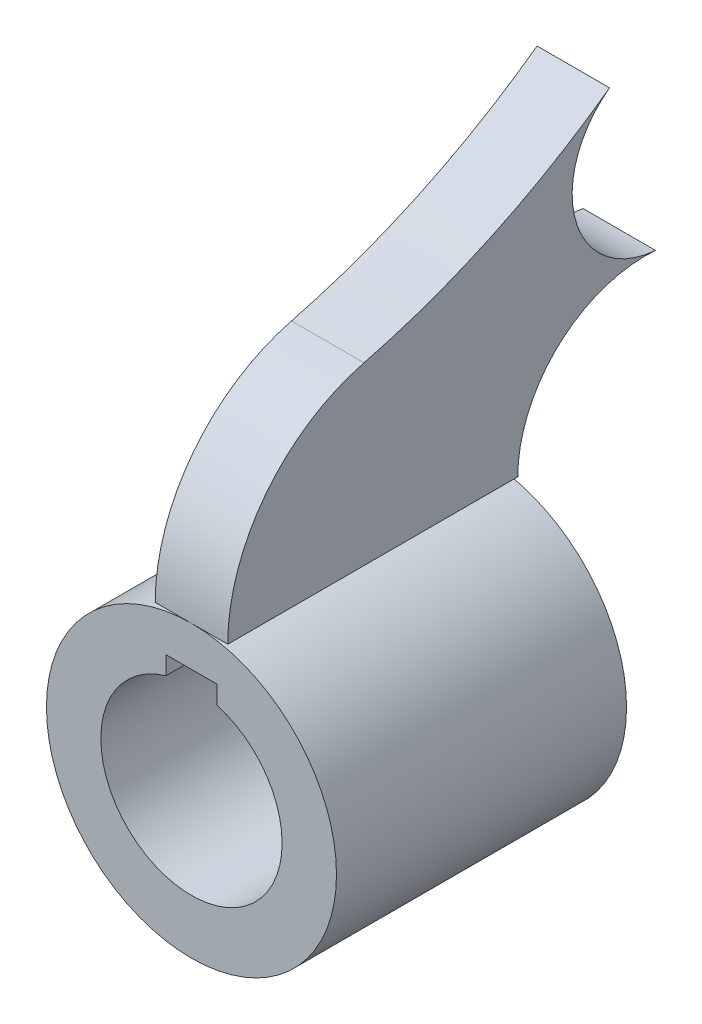
ISO-10303-21;
HEADER;
FILE_DESCRIPTION(('STEP AP214'),'2;1');
FILE_NAME('part.step','',(''),(''),'','','');
FILE_SCHEMA(('AUTOMOTIVE_DESIGN { 1 0 10303 214 1 1 1 1 }'));
ENDSEC;
DATA;
#1=APPLICATION_CONTEXT('core data for automotive mechanical design processes');
#2=APPLICATION_PROTOCOL_DEFINITION('international standard','automotive_design',2000,#1);
#3=PRODUCT_CONTEXT('',#1,'mechanical');
#4=PRODUCT('Part','Part','',(#3));
#5=PRODUCT_RELATED_PRODUCT_CATEGORY('part','',(#4));
#6=PRODUCT_DEFINITION_FORMATION('','',#4);
#7=PRODUCT_DEFINITION_CONTEXT('part definition',#1,'design');
#8=PRODUCT_DEFINITION('design','',#6,#7);
#9=PRODUCT_DEFINITION_SHAPE('','',#8);
#10=(LENGTH_UNIT() NAMED_UNIT(*) SI_UNIT(.MILLI.,.METRE.));
#11=(NAMED_UNIT(*) PLANE_ANGLE_UNIT() SI_UNIT($,.RADIAN.));
#12=(NAMED_UNIT(*) SI_UNIT($,.STERADIAN.) SOLID_ANGLE_UNIT());
#13=UNCERTAINTY_MEASURE_WITH_UNIT(LENGTH_MEASURE(1.E-05),#10,'distance_accuracy_value','');
#14=(GEOMETRIC_REPRESENTATION_CONTEXT(3) GLOBAL_UNCERTAINTY_ASSIGNED_CONTEXT((#13)) GLOBAL_UNIT_ASSIGNED_CONTEXT((#10,
#11,#12)) REPRESENTATION_CONTEXT('',''));
#15=CARTESIAN_POINT('',(0.,0.,0.));
#16=DIRECTION('',(0.,0.,1.));
#17=DIRECTION('',(1.,0.,0.));
#18=AXIS2_PLACEMENT_3D('',#15,#16,#17);
#19=CARTESIAN_POINT('',(10.,40.,0.));
#20=DIRECTION('',(0.,1.,0.));
#21=DIRECTION('',(0.,0.,1.));
#22=AXIS2_PLACEMENT_3D('',#19,#20,#21);
#23=PLANE('',#22);
#24=DIRECTION('',(0.,0.,-1.));
#25=VECTOR('',#24,1.);
#26=CARTESIAN_POINT('',(-10.,40.,0.));
#27=LINE('',#26,#25);
#28=CARTESIAN_POINT('',(-10.,40.,0.));
#29=VERTEX_POINT('',#28);
#30=CARTESIAN_POINT('',(-10.,40.,-80.));
#31=VERTEX_POINT('',#30);
#32=EDGE_CURVE('E131',#29,#31,#27,.T.);
#33=ORIENTED_EDGE('',*,*,#32,.T.);
#34=DIRECTION('',(-1.,0.,0.));
#35=VECTOR('',#34,1.);
#36=CARTESIAN_POINT('',(10.,40.,-80.));
#37=LINE('',#36,#35);
#38=CARTESIAN_POINT('',(10.,40.,-80.));
#39=VERTEX_POINT('',#38);
#40=EDGE_CURVE('E12',#39,#31,#37,.T.);
#41=ORIENTED_EDGE('',*,*,#40,.F.);
#42=DIRECTION('',(0.,0.,-1.));
#43=VECTOR('',#42,1.);
#44=CARTESIAN_POINT('',(10.,40.,0.));
#45=LINE('',#44,#43);
#46=CARTESIAN_POINT('',(10.,40.,0.));
#47=VERTEX_POINT('',#46);
#48=EDGE_CURVE('E145',#47,#39,#45,.T.);
#49=ORIENTED_EDGE('',*,*,#48,.F.);
#50=DIRECTION('',(-1.,0.,0.));
#51=VECTOR('',#50,1.);
#52=CARTESIAN_POINT('',(10.,40.,0.));
#53=LINE('',#52,#51);
#54=EDGE_CURVE('E71',#47,#29,#53,.T.);
#55=ORIENTED_EDGE('',*,*,#54,.T.);
#56=EDGE_LOOP('',(#33,#41,#49,#55));
#57=FACE_BOUND('',#56,.T.);
#58=ADVANCED_FACE('F60',(#57),#23,.F.);
#59=CARTESIAN_POINT('',(10.,40.,-115.192307692308));
#60=DIRECTION('',(-1.,0.,0.));
#61=DIRECTION('',(0.,0.,1.));
#62=AXIS2_PLACEMENT_3D('',#59,#60,#61);
#63=CYLINDRICAL_SURFACE('',#62,35.1923076923077);
#64=CARTESIAN_POINT('',(-10.,40.,-115.192307692308));
#65=DIRECTION('',(1.,0.,0.));
#66=DIRECTION('',(0.,0.,-1.));
#67=AXIS2_PLACEMENT_3D('',#64,#65,#66);
#68=CIRCLE('',#67,35.1923076923077);
#69=CARTESIAN_POINT('',(-10.,75.0798722044728,-118.003194888179));
#70=VERTEX_POINT('',#69);
#71=EDGE_CURVE('E133',#31,#70,#68,.F.);
#72=ORIENTED_EDGE('',*,*,#71,.T.);
#73=DIRECTION('',(-1.,0.,0.));
#74=VECTOR('',#73,1.);
#75=CARTESIAN_POINT('',(10.,75.0798722044728,-118.003194888179));
#76=LINE('',#75,#74);
#77=CARTESIAN_POINT('',(10.,75.0798722044728,-118.003194888179));
#78=VERTEX_POINT('',#77);
#79=EDGE_CURVE('E64',#78,#70,#76,.T.);
#80=ORIENTED_EDGE('',*,*,#79,.F.);
#81=CARTESIAN_POINT('',(10.,40.,-115.192307692308));
#82=DIRECTION('',(1.,0.,0.));
#83=DIRECTION('',(0.,0.,-1.));
#84=AXIS2_PLACEMENT_3D('',#81,#82,#83);
#85=CIRCLE('',#84,35.1923076923077);
#86=EDGE_CURVE('E105',#39,#78,#85,.F.);
#87=ORIENTED_EDGE('',*,*,#86,.F.);
#88=ORIENTED_EDGE('',*,*,#40,.T.);
#89=EDGE_LOOP('',(#72,#80,#87,#88));
#90=FACE_BOUND('',#89,.T.);
#91=ADVANCED_FACE('F143',(#90),#63,.F.);
#92=CARTESIAN_POINT('',(10.,100.,-120.));
#93=DIRECTION('',(-1.,0.,0.));
#94=DIRECTION('',(0.,0.,1.));
#95=AXIS2_PLACEMENT_3D('',#92,#93,#94);
#96=CYLINDRICAL_SURFACE('',#95,25.);
#97=CARTESIAN_POINT('',(-10.,100.,-120.));
#98=DIRECTION('',(1.,0.,0.));
#99=DIRECTION('',(0.,0.,-1.));
#100=AXIS2_PLACEMENT_3D('',#97,#98,#99);
#101=CIRCLE('',#100,25.);
#102=CARTESIAN_POINT('',(-10.,120.242034065651,-105.328256515157));
#103=VERTEX_POINT('',#102);
#104=EDGE_CURVE('E114',#103,#70,#101,.T.);
#105=ORIENTED_EDGE('',*,*,#104,.F.);
#106=DIRECTION('',(-1.,0.,0.));
#107=VECTOR('',#106,1.);
#108=CARTESIAN_POINT('',(10.,120.242034065651,-105.328256515157));
#109=LINE('',#108,#107);
#110=CARTESIAN_POINT('',(10.,120.242034065651,-105.328256515157));
#111=VERTEX_POINT('',#110);
#112=EDGE_CURVE('E107',#111,#103,#109,.T.);
#113=ORIENTED_EDGE('',*,*,#112,.F.);
#114=CARTESIAN_POINT('',(10.,100.,-120.));
#115=DIRECTION('',(1.,0.,0.));
#116=DIRECTION('',(0.,0.,-1.));
#117=AXIS2_PLACEMENT_3D('',#114,#115,#116);
#118=CIRCLE('',#117,25.);
#119=EDGE_CURVE('E115',#111,#78,#118,.T.);
#120=ORIENTED_EDGE('',*,*,#119,.T.);
#121=ORIENTED_EDGE('',*,*,#79,.T.);
#122=EDGE_LOOP('',(#105,#113,#120,#121));
#123=FACE_BOUND('',#122,.T.);
#124=ADVANCED_FACE('F112',(#123),#96,.F.);
#125=CARTESIAN_POINT('',(10.,282.178306590855,12.04569136359));
#126=DIRECTION('',(-1.,0.,0.));
#127=DIRECTION('',(0.,0.,1.));
#128=AXIS2_PLACEMENT_3D('',#125,#126,#127);
#129=CYLINDRICAL_SURFACE('',#128,200.);
#130=CARTESIAN_POINT('',(-10.,282.178306590855,12.04569136359));
#131=DIRECTION('',(1.,0.,0.));
#132=DIRECTION('',(0.,0.,-1.));
#133=AXIS2_PLACEMENT_3D('',#130,#131,#132);
#134=CIRCLE('',#133,200.);
#135=CARTESIAN_POINT('',(-10.,88.435661318171,-37.590861727282));
#136=VERTEX_POINT('',#135);
#137=EDGE_CURVE('E140',#136,#103,#134,.T.);
#138=ORIENTED_EDGE('',*,*,#137,.F.);
#139=DIRECTION('',(-1.,0.,0.));
#140=VECTOR('',#139,1.);
#141=CARTESIAN_POINT('',(10.,88.435661318171,-37.590861727282));
#142=LINE('',#141,#140);
#143=CARTESIAN_POINT('',(10.,88.435661318171,-37.590861727282));
#144=VERTEX_POINT('',#143);
#145=EDGE_CURVE('E89',#144,#136,#142,.T.);
#146=ORIENTED_EDGE('',*,*,#145,.F.);
#147=CARTESIAN_POINT('',(10.,282.178306590855,12.04569136359));
#148=DIRECTION('',(1.,0.,0.));
#149=DIRECTION('',(0.,0.,-1.));
#150=AXIS2_PLACEMENT_3D('',#147,#148,#149);
#151=CIRCLE('',#150,200.);
#152=EDGE_CURVE('E121',#144,#111,#151,.T.);
#153=ORIENTED_EDGE('',*,*,#152,.T.);
#154=ORIENTED_EDGE('',*,*,#112,.T.);
#155=EDGE_LOOP('',(#138,#146,#153,#154));
#156=FACE_BOUND('',#155,.T.);
#157=ADVANCED_FACE('F124',(#156),#129,.F.);
#158=CARTESIAN_POINT('',(10.,40.,-50.));
#159=DIRECTION('',(-1.,0.,0.));
#160=DIRECTION('',(0.,0.,1.));
#161=AXIS2_PLACEMENT_3D('',#158,#159,#160);
#162=CYLINDRICAL_SURFACE('',#161,50.);
#163=CARTESIAN_POINT('',(-10.,40.,-50.));
#164=DIRECTION('',(1.,0.,0.));
#165=DIRECTION('',(0.,0.,-1.));
#166=AXIS2_PLACEMENT_3D('',#163,#164,#165);
#167=CIRCLE('',#166,50.);
#168=EDGE_CURVE('E137',#29,#136,#167,.F.);
#169=ORIENTED_EDGE('',*,*,#168,.F.);
#170=ORIENTED_EDGE('',*,*,#54,.F.);
#171=CARTESIAN_POINT('',(10.,40.,-50.));
#172=DIRECTION('',(1.,0.,0.));
#173=DIRECTION('',(0.,0.,-1.));
#174=AXIS2_PLACEMENT_3D('',#171,#172,#173);
#175=CIRCLE('',#174,50.);
#176=EDGE_CURVE('E128',#47,#144,#175,.F.);
#177=ORIENTED_EDGE('',*,*,#176,.T.);
#178=ORIENTED_EDGE('',*,*,#145,.T.);
#179=EDGE_LOOP('',(#169,#170,#177,#178));
#180=FACE_BOUND('',#179,.T.);
#181=ADVANCED_FACE('F149',(#180),#162,.T.);
#182=CARTESIAN_POINT('',(10.,0.,0.));
#183=DIRECTION('',(1.,0.,0.));
#184=DIRECTION('',(0.,0.,-1.));
#185=AXIS2_PLACEMENT_3D('',#182,#183,#184);
#186=PLANE('',#185);
#187=ORIENTED_EDGE('',*,*,#48,.T.);
#188=ORIENTED_EDGE('',*,*,#86,.T.);
#189=ORIENTED_EDGE('',*,*,#119,.F.);
#190=ORIENTED_EDGE('',*,*,#152,.F.);
#191=ORIENTED_EDGE('',*,*,#176,.F.);
#192=EDGE_LOOP('',(#187,#188,#189,#190,#191));
#193=FACE_BOUND('',#192,.T.);
#194=ADVANCED_FACE('F123',(#193),#186,.T.);
#195=CARTESIAN_POINT('',(-10.,0.,0.));
#196=DIRECTION('',(1.,0.,0.));
#197=DIRECTION('',(0.,0.,-1.));
#198=AXIS2_PLACEMENT_3D('',#195,#196,#197);
#199=PLANE('',#198);
#200=ORIENTED_EDGE('',*,*,#32,.F.);
#201=ORIENTED_EDGE('',*,*,#168,.T.);
#202=ORIENTED_EDGE('',*,*,#137,.T.);
#203=ORIENTED_EDGE('',*,*,#104,.T.);
#204=ORIENTED_EDGE('',*,*,#71,.F.);
#205=EDGE_LOOP('',(#200,#201,#202,#203,#204));
#206=FACE_BOUND('',#205,.T.);
#207=ADVANCED_FACE('F150',(#206),#199,.F.);
#208=CLOSED_SHELL('',(#58,#91,#124,#157,#181,#194,#207));
#209=MANIFOLD_SOLID_BREP('B2',#208);
#210=CARTESIAN_POINT('',(0.,0.,-80.));
#211=DIRECTION('',(0.,0.,1.));
#212=DIRECTION('',(1.,0.,0.));
#213=AXIS2_PLACEMENT_3D('',#210,#211,#212);
#214=CYLINDRICAL_SURFACE('',#213,40.);
#215=CARTESIAN_POINT('',(0.,0.,-80.));
#216=DIRECTION('',(0.,0.,1.));
#217=DIRECTION('',(1.,0.,0.));
#218=AXIS2_PLACEMENT_3D('',#215,#216,#217);
#219=CIRCLE('',#218,40.);
#220=CARTESIAN_POINT('',(40.,0.,-80.));
#221=VERTEX_POINT('',#220);
#222=EDGE_CURVE('E54',#221,#221,#219,.T.);
#223=ORIENTED_EDGE('',*,*,#222,.T.);
#224=EDGE_LOOP('',(#223));
#225=FACE_BOUND('',#224,.T.);
#226=CARTESIAN_POINT('',(0.,0.,0.));
#227=DIRECTION('',(0.,0.,1.));
#228=DIRECTION('',(1.,0.,0.));
#229=AXIS2_PLACEMENT_3D('',#226,#227,#228);
#230=CIRCLE('',#229,40.);
#231=CARTESIAN_POINT('',(40.,0.,0.));
#232=VERTEX_POINT('',#231);
#233=EDGE_CURVE('E209',#232,#232,#230,.T.);
#234=ORIENTED_EDGE('',*,*,#233,.F.);
#235=EDGE_LOOP('',(#234));
#236=FACE_BOUND('',#235,.T.);
#237=ADVANCED_FACE('F210',(#225,#236),#214,.T.);
#238=CARTESIAN_POINT('',(0.,0.,-80.));
#239=DIRECTION('',(0.,0.,1.));
#240=DIRECTION('',(1.,0.,0.));
#241=AXIS2_PLACEMENT_3D('',#238,#239,#240);
#242=PLANE('',#241);
#243=DIRECTION('',(-1.,0.,0.));
#244=VECTOR('',#243,1.);
#245=CARTESIAN_POINT('',(-7.,29.,-80.));
#246=LINE('',#245,#244);
#247=CARTESIAN_POINT('',(7.,29.,-80.));
#248=VERTEX_POINT('',#247);
#249=CARTESIAN_POINT('',(-7.,29.,-80.));
#250=VERTEX_POINT('',#249);
#251=EDGE_CURVE('E257',#248,#250,#246,.T.);
#252=ORIENTED_EDGE('',*,*,#251,.T.);
#253=DIRECTION('',(0.,-1.,0.));
#254=VECTOR('',#253,1.);
#255=CARTESIAN_POINT('',(-7.,29.,-80.));
#256=LINE('',#255,#254);
#257=CARTESIAN_POINT('',(-7.,24.,-80.));
#258=VERTEX_POINT('',#257);
#259=EDGE_CURVE('E248',#250,#258,#256,.T.);
#260=ORIENTED_EDGE('',*,*,#259,.T.);
#261=CARTESIAN_POINT('',(0.,0.,-80.));
#262=DIRECTION('',(0.,0.,1.));
#263=DIRECTION('',(1.,0.,0.));
#264=AXIS2_PLACEMENT_3D('',#261,#262,#263);
#265=CIRCLE('',#264,25.);
#266=CARTESIAN_POINT('',(7.,24.,-80.));
#267=VERTEX_POINT('',#266);
#268=EDGE_CURVE('E259',#258,#267,#265,.T.);
#269=ORIENTED_EDGE('',*,*,#268,.T.);
#270=DIRECTION('',(0.,1.,0.));
#271=VECTOR('',#270,1.);
#272=CARTESIAN_POINT('',(7.,29.,-80.));
#273=LINE('',#272,#271);
#274=EDGE_CURVE('E225',#267,#248,#273,.T.);
#275=ORIENTED_EDGE('',*,*,#274,.T.);
#276=EDGE_LOOP('',(#252,#260,#269,#275));
#277=FACE_BOUND('',#276,.T.);
#278=ORIENTED_EDGE('',*,*,#222,.F.);
#279=EDGE_LOOP('',(#278));
#280=FACE_BOUND('',#279,.T.);
#281=ADVANCED_FACE('F262',(#277,#280),#242,.F.);
#282=CARTESIAN_POINT('',(0.,0.,0.));
#283=DIRECTION('',(0.,0.,1.));
#284=DIRECTION('',(1.,0.,0.));
#285=AXIS2_PLACEMENT_3D('',#282,#283,#284);
#286=PLANE('',#285);
#287=DIRECTION('',(0.,-1.,0.));
#288=VECTOR('',#287,1.);
#289=CARTESIAN_POINT('',(-7.,29.,0.));
#290=LINE('',#289,#288);
#291=CARTESIAN_POINT('',(-7.,29.,0.));
#292=VERTEX_POINT('',#291);
#293=CARTESIAN_POINT('',(-7.,24.,0.));
#294=VERTEX_POINT('',#293);
#295=EDGE_CURVE('E229',#292,#294,#290,.T.);
#296=ORIENTED_EDGE('',*,*,#295,.F.);
#297=DIRECTION('',(-1.,0.,0.));
#298=VECTOR('',#297,1.);
#299=CARTESIAN_POINT('',(-7.,29.,0.));
#300=LINE('',#299,#298);
#301=CARTESIAN_POINT('',(7.,29.,0.));
#302=VERTEX_POINT('',#301);
#303=EDGE_CURVE('E267',#302,#292,#300,.T.);
#304=ORIENTED_EDGE('',*,*,#303,.F.);
#305=DIRECTION('',(0.,1.,0.));
#306=VECTOR('',#305,1.);
#307=CARTESIAN_POINT('',(7.,29.,0.));
#308=LINE('',#307,#306);
#309=CARTESIAN_POINT('',(7.,24.,0.));
#310=VERTEX_POINT('',#309);
#311=EDGE_CURVE('E273',#310,#302,#308,.T.);
#312=ORIENTED_EDGE('',*,*,#311,.F.);
#313=CARTESIAN_POINT('',(0.,0.,0.));
#314=DIRECTION('',(0.,0.,1.));
#315=DIRECTION('',(1.,0.,0.));
#316=AXIS2_PLACEMENT_3D('',#313,#314,#315);
#317=CIRCLE('',#316,25.);
#318=EDGE_CURVE('E285',#294,#310,#317,.T.);
#319=ORIENTED_EDGE('',*,*,#318,.F.);
#320=EDGE_LOOP('',(#296,#304,#312,#319));
#321=FACE_BOUND('',#320,.T.);
#322=ORIENTED_EDGE('',*,*,#233,.T.);
#323=EDGE_LOOP('',(#322));
#324=FACE_BOUND('',#323,.T.);
#325=ADVANCED_FACE('F297',(#321,#324),#286,.T.);
#326=CARTESIAN_POINT('',(-7.,29.,-80.));
#327=DIRECTION('',(-1.,0.,0.));
#328=DIRECTION('',(0.,0.,1.));
#329=AXIS2_PLACEMENT_3D('',#326,#327,#328);
#330=PLANE('',#329);
#331=ORIENTED_EDGE('',*,*,#295,.T.);
#332=DIRECTION('',(0.,0.,1.));
#333=VECTOR('',#332,1.);
#334=CARTESIAN_POINT('',(-7.,24.,-80.));
#335=LINE('',#334,#333);
#336=EDGE_CURVE('E247',#258,#294,#335,.T.);
#337=ORIENTED_EDGE('',*,*,#336,.F.);
#338=ORIENTED_EDGE('',*,*,#259,.F.);
#339=DIRECTION('',(0.,0.,1.));
#340=VECTOR('',#339,1.);
#341=CARTESIAN_POINT('',(-7.,29.,-80.));
#342=LINE('',#341,#340);
#343=EDGE_CURVE('E286',#250,#292,#342,.T.);
#344=ORIENTED_EDGE('',*,*,#343,.T.);
#345=EDGE_LOOP('',(#331,#337,#338,#344));
#346=FACE_BOUND('',#345,.T.);
#347=ADVANCED_FACE('F246',(#346),#330,.F.);
#348=CARTESIAN_POINT('',(-7.,29.,-80.));
#349=DIRECTION('',(0.,1.,0.));
#350=DIRECTION('',(0.,0.,1.));
#351=AXIS2_PLACEMENT_3D('',#348,#349,#350);
#352=PLANE('',#351);
#353=ORIENTED_EDGE('',*,*,#303,.T.);
#354=ORIENTED_EDGE('',*,*,#343,.F.);
#355=ORIENTED_EDGE('',*,*,#251,.F.);
#356=DIRECTION('',(0.,0.,1.));
#357=VECTOR('',#356,1.);
#358=CARTESIAN_POINT('',(7.,29.,-80.));
#359=LINE('',#358,#357);
#360=EDGE_CURVE('E292',#248,#302,#359,.T.);
#361=ORIENTED_EDGE('',*,*,#360,.T.);
#362=EDGE_LOOP('',(#353,#354,#355,#361));
#363=FACE_BOUND('',#362,.T.);
#364=ADVANCED_FACE('F302',(#363),#352,.F.);
#365=CARTESIAN_POINT('',(7.,29.,-80.));
#366=DIRECTION('',(1.,0.,0.));
#367=DIRECTION('',(0.,0.,-1.));
#368=AXIS2_PLACEMENT_3D('',#365,#366,#367);
#369=PLANE('',#368);
#370=ORIENTED_EDGE('',*,*,#311,.T.);
#371=ORIENTED_EDGE('',*,*,#360,.F.);
#372=ORIENTED_EDGE('',*,*,#274,.F.);
#373=DIRECTION('',(0.,0.,1.));
#374=VECTOR('',#373,1.);
#375=CARTESIAN_POINT('',(7.,24.,-80.));
#376=LINE('',#375,#374);
#377=EDGE_CURVE('E258',#267,#310,#376,.T.);
#378=ORIENTED_EDGE('',*,*,#377,.T.);
#379=EDGE_LOOP('',(#370,#371,#372,#378));
#380=FACE_BOUND('',#379,.T.);
#381=ADVANCED_FACE('F293',(#380),#369,.F.);
#382=CARTESIAN_POINT('',(0.,0.,-80.));
#383=DIRECTION('',(0.,0.,1.));
#384=DIRECTION('',(1.,0.,0.));
#385=AXIS2_PLACEMENT_3D('',#382,#383,#384);
#386=CYLINDRICAL_SURFACE('',#385,25.);
#387=ORIENTED_EDGE('',*,*,#318,.T.);
#388=ORIENTED_EDGE('',*,*,#377,.F.);
#389=ORIENTED_EDGE('',*,*,#268,.F.);
#390=ORIENTED_EDGE('',*,*,#336,.T.);
#391=EDGE_LOOP('',(#387,#388,#389,#390));
#392=FACE_BOUND('',#391,.T.);
#393=ADVANCED_FACE('F263',(#392),#386,.F.);
#394=CLOSED_SHELL('',(#237,#281,#325,#347,#364,#381,#393));
#395=MANIFOLD_SOLID_BREP('B6',#394);
#396=ADVANCED_BREP_SHAPE_REPRESENTATION('',(#18,#209,#395),#14);
#397=SHAPE_DEFINITION_REPRESENTATION(#9,#396);
ENDSEC;
END-ISO-10303-21;
